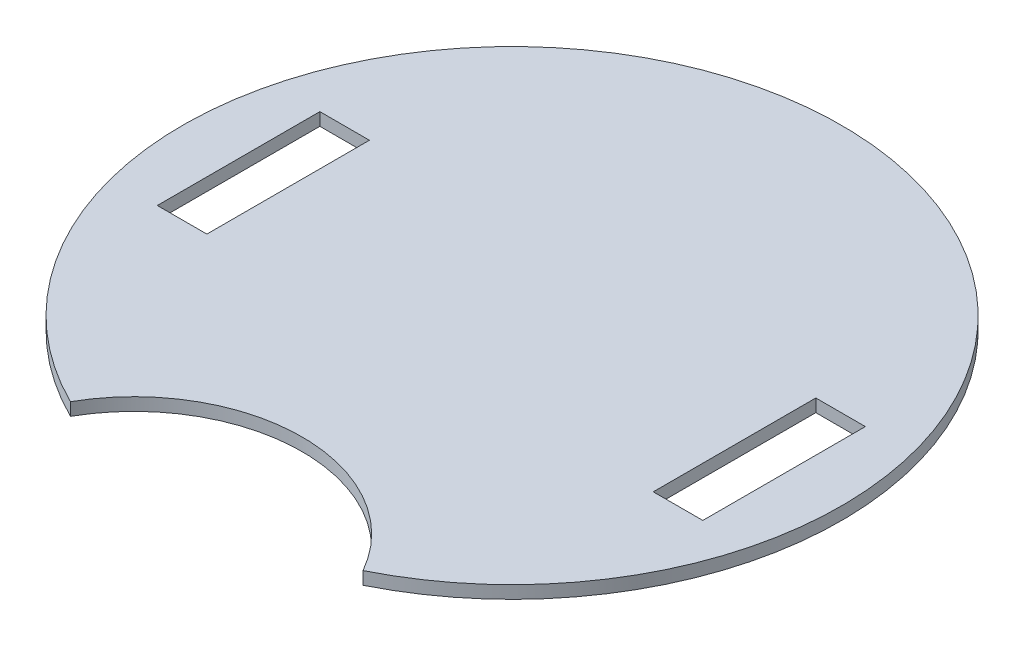
ISO-10303-21;
HEADER;
FILE_DESCRIPTION(('STEP AP214'),'2;1');
FILE_NAME('part.step','',(''),(''),'','','');
FILE_SCHEMA(('AUTOMOTIVE_DESIGN { 1 0 10303 214 1 1 1 1 }'));
ENDSEC;
DATA;
#1=APPLICATION_CONTEXT('core data for automotive mechanical design processes');
#2=APPLICATION_PROTOCOL_DEFINITION('international standard','automotive_design',2000,#1);
#3=PRODUCT_CONTEXT('',#1,'mechanical');
#4=PRODUCT('Part','Part','',(#3));
#5=PRODUCT_RELATED_PRODUCT_CATEGORY('part','',(#4));
#6=PRODUCT_DEFINITION_FORMATION('','',#4);
#7=PRODUCT_DEFINITION_CONTEXT('part definition',#1,'design');
#8=PRODUCT_DEFINITION('design','',#6,#7);
#9=PRODUCT_DEFINITION_SHAPE('','',#8);
#10=(LENGTH_UNIT() NAMED_UNIT(*) SI_UNIT(.MILLI.,.METRE.));
#11=(NAMED_UNIT(*) PLANE_ANGLE_UNIT() SI_UNIT($,.RADIAN.));
#12=(NAMED_UNIT(*) SI_UNIT($,.STERADIAN.) SOLID_ANGLE_UNIT());
#13=UNCERTAINTY_MEASURE_WITH_UNIT(LENGTH_MEASURE(1.E-05),#10,'distance_accuracy_value','');
#14=(GEOMETRIC_REPRESENTATION_CONTEXT(3) GLOBAL_UNCERTAINTY_ASSIGNED_CONTEXT((#13)) GLOBAL_UNIT_ASSIGNED_CONTEXT((#10,
#11,#12)) REPRESENTATION_CONTEXT('',''));
#15=CARTESIAN_POINT('',(0.,0.,0.));
#16=DIRECTION('',(0.,0.,1.));
#17=DIRECTION('',(1.,0.,0.));
#18=AXIS2_PLACEMENT_3D('',#15,#16,#17);
#19=CARTESIAN_POINT('',(0.,2.9,86.0416168146049));
#20=DIRECTION('',(0.,-1.,0.));
#21=DIRECTION('',(0.,0.,-1.));
#22=AXIS2_PLACEMENT_3D('',#19,#20,#21);
#23=CYLINDRICAL_SURFACE('',#22,38.25);
#24=CARTESIAN_POINT('',(0.,0.,86.0416168146049));
#25=DIRECTION('',(0.,-1.,0.));
#26=DIRECTION('',(0.,0.,1.));
#27=AXIS2_PLACEMENT_3D('',#24,#25,#26);
#28=CIRCLE('',#27,38.25);
#29=CARTESIAN_POINT('',(-33.2911053697012,0.,67.2064156406474));
#30=VERTEX_POINT('',#29);
#31=CARTESIAN_POINT('',(33.2911053697012,0.,67.2064156406474));
#32=VERTEX_POINT('',#31);
#33=EDGE_CURVE('E171',#30,#32,#28,.T.);
#34=ORIENTED_EDGE('',*,*,#33,.T.);
#35=DIRECTION('',(0.,-1.,0.));
#36=VECTOR('',#35,1.);
#37=CARTESIAN_POINT('',(33.2911053697012,2.9,67.2064156406474));
#38=LINE('',#37,#36);
#39=CARTESIAN_POINT('',(33.2911053697012,2.9,67.2064156406474));
#40=VERTEX_POINT('',#39);
#41=EDGE_CURVE('E11',#40,#32,#38,.T.);
#42=ORIENTED_EDGE('',*,*,#41,.F.);
#43=CARTESIAN_POINT('',(0.,2.9,86.0416168146049));
#44=DIRECTION('',(0.,-1.,0.));
#45=DIRECTION('',(0.,0.,1.));
#46=AXIS2_PLACEMENT_3D('',#43,#44,#45);
#47=CIRCLE('',#46,38.25);
#48=CARTESIAN_POINT('',(-33.2911053697012,2.9,67.2064156406474));
#49=VERTEX_POINT('',#48);
#50=EDGE_CURVE('E178',#49,#40,#47,.T.);
#51=ORIENTED_EDGE('',*,*,#50,.F.);
#52=DIRECTION('',(0.,-1.,0.));
#53=VECTOR('',#52,1.);
#54=CARTESIAN_POINT('',(-33.2911053697012,2.9,67.2064156406474));
#55=LINE('',#54,#53);
#56=EDGE_CURVE('E40',#49,#30,#55,.T.);
#57=ORIENTED_EDGE('',*,*,#56,.T.);
#58=EDGE_LOOP('',(#34,#42,#51,#57));
#59=FACE_BOUND('',#58,.T.);
#60=ADVANCED_FACE('F33',(#59),#23,.F.);
#61=CARTESIAN_POINT('',(0.,2.9,0.));
#62=DIRECTION('',(0.,-1.,0.));
#63=DIRECTION('',(0.,0.,-1.));
#64=AXIS2_PLACEMENT_3D('',#61,#62,#63);
#65=CYLINDRICAL_SURFACE('',#64,75.);
#66=CARTESIAN_POINT('',(0.,0.,0.));
#67=DIRECTION('',(0.,1.,0.));
#68=DIRECTION('',(0.,0.,1.));
#69=AXIS2_PLACEMENT_3D('',#66,#67,#68);
#70=CIRCLE('',#69,75.);
#71=EDGE_CURVE('E182',#32,#30,#70,.T.);
#72=ORIENTED_EDGE('',*,*,#71,.T.);
#73=ORIENTED_EDGE('',*,*,#56,.F.);
#74=CARTESIAN_POINT('',(0.,2.9,0.));
#75=DIRECTION('',(0.,1.,0.));
#76=DIRECTION('',(0.,0.,1.));
#77=AXIS2_PLACEMENT_3D('',#74,#75,#76);
#78=CIRCLE('',#77,75.);
#79=EDGE_CURVE('E181',#40,#49,#78,.T.);
#80=ORIENTED_EDGE('',*,*,#79,.F.);
#81=ORIENTED_EDGE('',*,*,#41,.T.);
#82=EDGE_LOOP('',(#72,#73,#80,#81));
#83=FACE_BOUND('',#82,.T.);
#84=ADVANCED_FACE('F194',(#83),#65,.T.);
#85=CARTESIAN_POINT('',(0.,2.9,43.0208084073025));
#86=DIRECTION('',(0.,1.,0.));
#87=DIRECTION('',(0.,0.,1.));
#88=AXIS2_PLACEMENT_3D('',#85,#86,#87);
#89=PLANE('',#88);
#90=DIRECTION('',(0.,0.,1.));
#91=VECTOR('',#90,1.);
#92=CARTESIAN_POINT('',(-62.0709467802583,2.9,-18.3300396675502));
#93=LINE('',#92,#91);
#94=CARTESIAN_POINT('',(-62.0709467802583,2.9,-18.3300396675502));
#95=VERTEX_POINT('',#94);
#96=CARTESIAN_POINT('',(-62.0709467802583,2.9,18.6617271703361));
#97=VERTEX_POINT('',#96);
#98=EDGE_CURVE('E47',#95,#97,#93,.T.);
#99=ORIENTED_EDGE('',*,*,#98,.F.);
#100=DIRECTION('',(-1.,0.,0.));
#101=VECTOR('',#100,1.);
#102=CARTESIAN_POINT('',(-62.0709467802583,2.9,-18.3300396675502));
#103=LINE('',#102,#101);
#104=CARTESIAN_POINT('',(-50.7952486102618,2.9,-18.3300396675502));
#105=VERTEX_POINT('',#104);
#106=EDGE_CURVE('E127',#105,#95,#103,.T.);
#107=ORIENTED_EDGE('',*,*,#106,.F.);
#108=DIRECTION('',(0.,0.,-1.));
#109=VECTOR('',#108,1.);
#110=CARTESIAN_POINT('',(-50.7952486102618,2.9,-18.3300396675502));
#111=LINE('',#110,#109);
#112=CARTESIAN_POINT('',(-50.7952486102618,2.9,18.6617271703361));
#113=VERTEX_POINT('',#112);
#114=EDGE_CURVE('E130',#113,#105,#111,.T.);
#115=ORIENTED_EDGE('',*,*,#114,.F.);
#116=DIRECTION('',(1.,0.,0.));
#117=VECTOR('',#116,1.);
#118=CARTESIAN_POINT('',(-62.0709467802583,2.9,18.6617271703361));
#119=LINE('',#118,#117);
#120=EDGE_CURVE('E136',#97,#113,#119,.T.);
#121=ORIENTED_EDGE('',*,*,#120,.F.);
#122=EDGE_LOOP('',(#99,#107,#115,#121));
#123=FACE_BOUND('',#122,.T.);
#124=DIRECTION('',(0.,0.,1.));
#125=VECTOR('',#124,1.);
#126=CARTESIAN_POINT('',(50.7952486102618,2.9,-18.3300396675502));
#127=LINE('',#126,#125);
#128=CARTESIAN_POINT('',(50.7952486102618,2.9,-18.3300396675502));
#129=VERTEX_POINT('',#128);
#130=CARTESIAN_POINT('',(50.7952486102618,2.9,18.6617271703361));
#131=VERTEX_POINT('',#130);
#132=EDGE_CURVE('E142',#129,#131,#127,.T.);
#133=ORIENTED_EDGE('',*,*,#132,.F.);
#134=DIRECTION('',(-1.,0.,0.));
#135=VECTOR('',#134,1.);
#136=CARTESIAN_POINT('',(62.0709467802583,2.9,-18.3300396675502));
#137=LINE('',#136,#135);
#138=CARTESIAN_POINT('',(62.0709467802583,2.9,-18.3300396675502));
#139=VERTEX_POINT('',#138);
#140=EDGE_CURVE('E150',#139,#129,#137,.T.);
#141=ORIENTED_EDGE('',*,*,#140,.F.);
#142=DIRECTION('',(0.,0.,-1.));
#143=VECTOR('',#142,1.);
#144=CARTESIAN_POINT('',(62.0709467802583,2.9,-18.3300396675502));
#145=LINE('',#144,#143);
#146=CARTESIAN_POINT('',(62.0709467802583,2.9,18.6617271703361));
#147=VERTEX_POINT('',#146);
#148=EDGE_CURVE('E164',#147,#139,#145,.T.);
#149=ORIENTED_EDGE('',*,*,#148,.F.);
#150=DIRECTION('',(1.,0.,0.));
#151=VECTOR('',#150,1.);
#152=CARTESIAN_POINT('',(62.0709467802583,2.9,18.6617271703361));
#153=LINE('',#152,#151);
#154=EDGE_CURVE('E161',#131,#147,#153,.T.);
#155=ORIENTED_EDGE('',*,*,#154,.F.);
#156=EDGE_LOOP('',(#133,#141,#149,#155));
#157=FACE_BOUND('',#156,.T.);
#158=ORIENTED_EDGE('',*,*,#50,.T.);
#159=ORIENTED_EDGE('',*,*,#79,.T.);
#160=EDGE_LOOP('',(#158,#159));
#161=FACE_BOUND('',#160,.T.);
#162=ADVANCED_FACE('F196',(#123,#157,#161),#89,.T.);
#163=CARTESIAN_POINT('',(0.,0.,43.0208084073025));
#164=DIRECTION('',(0.,1.,0.));
#165=DIRECTION('',(0.,0.,1.));
#166=AXIS2_PLACEMENT_3D('',#163,#164,#165);
#167=PLANE('',#166);
#168=DIRECTION('',(-1.,0.,0.));
#169=VECTOR('',#168,1.);
#170=CARTESIAN_POINT('',(-62.0709467802583,0.,-18.3300396675502));
#171=LINE('',#170,#169);
#172=CARTESIAN_POINT('',(-50.7952486102618,0.,-18.3300396675502));
#173=VERTEX_POINT('',#172);
#174=CARTESIAN_POINT('',(-62.0709467802583,0.,-18.3300396675502));
#175=VERTEX_POINT('',#174);
#176=EDGE_CURVE('E117',#173,#175,#171,.T.);
#177=ORIENTED_EDGE('',*,*,#176,.T.);
#178=DIRECTION('',(0.,0.,1.));
#179=VECTOR('',#178,1.);
#180=CARTESIAN_POINT('',(-62.0709467802583,0.,-18.3300396675502));
#181=LINE('',#180,#179);
#182=CARTESIAN_POINT('',(-62.0709467802583,0.,18.6617271703361));
#183=VERTEX_POINT('',#182);
#184=EDGE_CURVE('E111',#175,#183,#181,.T.);
#185=ORIENTED_EDGE('',*,*,#184,.T.);
#186=DIRECTION('',(1.,0.,0.));
#187=VECTOR('',#186,1.);
#188=CARTESIAN_POINT('',(-62.0709467802583,0.,18.6617271703361));
#189=LINE('',#188,#187);
#190=CARTESIAN_POINT('',(-50.7952486102618,0.,18.6617271703361));
#191=VERTEX_POINT('',#190);
#192=EDGE_CURVE('E120',#183,#191,#189,.T.);
#193=ORIENTED_EDGE('',*,*,#192,.T.);
#194=DIRECTION('',(0.,0.,-1.));
#195=VECTOR('',#194,1.);
#196=CARTESIAN_POINT('',(-50.7952486102618,0.,-18.3300396675502));
#197=LINE('',#196,#195);
#198=EDGE_CURVE('E55',#191,#173,#197,.T.);
#199=ORIENTED_EDGE('',*,*,#198,.T.);
#200=EDGE_LOOP('',(#177,#185,#193,#199));
#201=FACE_BOUND('',#200,.T.);
#202=DIRECTION('',(-1.,0.,0.));
#203=VECTOR('',#202,1.);
#204=CARTESIAN_POINT('',(62.0709467802583,0.,-18.3300396675502));
#205=LINE('',#204,#203);
#206=CARTESIAN_POINT('',(62.0709467802583,0.,-18.3300396675502));
#207=VERTEX_POINT('',#206);
#208=CARTESIAN_POINT('',(50.7952486102618,0.,-18.3300396675502));
#209=VERTEX_POINT('',#208);
#210=EDGE_CURVE('E156',#207,#209,#205,.T.);
#211=ORIENTED_EDGE('',*,*,#210,.T.);
#212=DIRECTION('',(0.,0.,1.));
#213=VECTOR('',#212,1.);
#214=CARTESIAN_POINT('',(50.7952486102618,0.,-18.3300396675502));
#215=LINE('',#214,#213);
#216=CARTESIAN_POINT('',(50.7952486102618,0.,18.6617271703361));
#217=VERTEX_POINT('',#216);
#218=EDGE_CURVE('E146',#209,#217,#215,.T.);
#219=ORIENTED_EDGE('',*,*,#218,.T.);
#220=DIRECTION('',(1.,0.,0.));
#221=VECTOR('',#220,1.);
#222=CARTESIAN_POINT('',(62.0709467802583,0.,18.6617271703361));
#223=LINE('',#222,#221);
#224=CARTESIAN_POINT('',(62.0709467802583,0.,18.6617271703361));
#225=VERTEX_POINT('',#224);
#226=EDGE_CURVE('E149',#217,#225,#223,.T.);
#227=ORIENTED_EDGE('',*,*,#226,.T.);
#228=DIRECTION('',(0.,0.,-1.));
#229=VECTOR('',#228,1.);
#230=CARTESIAN_POINT('',(62.0709467802583,0.,-18.3300396675502));
#231=LINE('',#230,#229);
#232=EDGE_CURVE('E153',#225,#207,#231,.T.);
#233=ORIENTED_EDGE('',*,*,#232,.T.);
#234=EDGE_LOOP('',(#211,#219,#227,#233));
#235=FACE_BOUND('',#234,.T.);
#236=ORIENTED_EDGE('',*,*,#33,.F.);
#237=ORIENTED_EDGE('',*,*,#71,.F.);
#238=EDGE_LOOP('',(#236,#237));
#239=FACE_BOUND('',#238,.T.);
#240=ADVANCED_FACE('F124',(#201,#235,#239),#167,.F.);
#241=CARTESIAN_POINT('',(50.7952486102618,0.,-18.3300396675502));
#242=DIRECTION('',(-1.,0.,0.));
#243=DIRECTION('',(0.,0.,1.));
#244=AXIS2_PLACEMENT_3D('',#241,#242,#243);
#245=PLANE('',#244);
#246=ORIENTED_EDGE('',*,*,#132,.T.);
#247=DIRECTION('',(0.,1.,0.));
#248=VECTOR('',#247,1.);
#249=CARTESIAN_POINT('',(50.7952486102618,0.,18.6617271703361));
#250=LINE('',#249,#248);
#251=EDGE_CURVE('E159',#217,#131,#250,.T.);
#252=ORIENTED_EDGE('',*,*,#251,.F.);
#253=ORIENTED_EDGE('',*,*,#218,.F.);
#254=DIRECTION('',(0.,1.,0.));
#255=VECTOR('',#254,1.);
#256=CARTESIAN_POINT('',(50.7952486102618,0.,-18.3300396675502));
#257=LINE('',#256,#255);
#258=EDGE_CURVE('E169',#209,#129,#257,.T.);
#259=ORIENTED_EDGE('',*,*,#258,.T.);
#260=EDGE_LOOP('',(#246,#252,#253,#259));
#261=FACE_BOUND('',#260,.T.);
#262=ADVANCED_FACE('F204',(#261),#245,.F.);
#263=CARTESIAN_POINT('',(62.0709467802583,0.,-18.3300396675502));
#264=DIRECTION('',(0.,0.,-1.));
#265=DIRECTION('',(-1.,0.,0.));
#266=AXIS2_PLACEMENT_3D('',#263,#264,#265);
#267=PLANE('',#266);
#268=ORIENTED_EDGE('',*,*,#140,.T.);
#269=ORIENTED_EDGE('',*,*,#258,.F.);
#270=ORIENTED_EDGE('',*,*,#210,.F.);
#271=DIRECTION('',(0.,1.,0.));
#272=VECTOR('',#271,1.);
#273=CARTESIAN_POINT('',(62.0709467802583,0.,-18.3300396675502));
#274=LINE('',#273,#272);
#275=EDGE_CURVE('E172',#207,#139,#274,.T.);
#276=ORIENTED_EDGE('',*,*,#275,.T.);
#277=EDGE_LOOP('',(#268,#269,#270,#276));
#278=FACE_BOUND('',#277,.T.);
#279=ADVANCED_FACE('F234',(#278),#267,.F.);
#280=CARTESIAN_POINT('',(62.0709467802583,0.,-18.3300396675502));
#281=DIRECTION('',(1.,0.,0.));
#282=DIRECTION('',(0.,0.,-1.));
#283=AXIS2_PLACEMENT_3D('',#280,#281,#282);
#284=PLANE('',#283);
#285=ORIENTED_EDGE('',*,*,#148,.T.);
#286=ORIENTED_EDGE('',*,*,#275,.F.);
#287=ORIENTED_EDGE('',*,*,#232,.F.);
#288=DIRECTION('',(0.,1.,0.));
#289=VECTOR('',#288,1.);
#290=CARTESIAN_POINT('',(62.0709467802583,0.,18.6617271703361));
#291=LINE('',#290,#289);
#292=EDGE_CURVE('E174',#225,#147,#291,.T.);
#293=ORIENTED_EDGE('',*,*,#292,.T.);
#294=EDGE_LOOP('',(#285,#286,#287,#293));
#295=FACE_BOUND('',#294,.T.);
#296=ADVANCED_FACE('F243',(#295),#284,.F.);
#297=CARTESIAN_POINT('',(62.0709467802583,0.,18.6617271703361));
#298=DIRECTION('',(0.,0.,1.));
#299=DIRECTION('',(1.,0.,0.));
#300=AXIS2_PLACEMENT_3D('',#297,#298,#299);
#301=PLANE('',#300);
#302=ORIENTED_EDGE('',*,*,#154,.T.);
#303=ORIENTED_EDGE('',*,*,#292,.F.);
#304=ORIENTED_EDGE('',*,*,#226,.F.);
#305=ORIENTED_EDGE('',*,*,#251,.T.);
#306=EDGE_LOOP('',(#302,#303,#304,#305));
#307=FACE_BOUND('',#306,.T.);
#308=ADVANCED_FACE('F253',(#307),#301,.F.);
#309=CARTESIAN_POINT('',(-62.0709467802583,0.,-18.3300396675502));
#310=DIRECTION('',(-1.,0.,0.));
#311=DIRECTION('',(0.,0.,1.));
#312=AXIS2_PLACEMENT_3D('',#309,#310,#311);
#313=PLANE('',#312);
#314=ORIENTED_EDGE('',*,*,#98,.T.);
#315=DIRECTION('',(0.,1.,0.));
#316=VECTOR('',#315,1.);
#317=CARTESIAN_POINT('',(-62.0709467802583,0.,18.6617271703361));
#318=LINE('',#317,#316);
#319=EDGE_CURVE('E107',#183,#97,#318,.T.);
#320=ORIENTED_EDGE('',*,*,#319,.F.);
#321=ORIENTED_EDGE('',*,*,#184,.F.);
#322=DIRECTION('',(0.,1.,0.));
#323=VECTOR('',#322,1.);
#324=CARTESIAN_POINT('',(-62.0709467802583,0.,-18.3300396675502));
#325=LINE('',#324,#323);
#326=EDGE_CURVE('E140',#175,#95,#325,.T.);
#327=ORIENTED_EDGE('',*,*,#326,.T.);
#328=EDGE_LOOP('',(#314,#320,#321,#327));
#329=FACE_BOUND('',#328,.T.);
#330=ADVANCED_FACE('F109',(#329),#313,.F.);
#331=CARTESIAN_POINT('',(-62.0709467802583,0.,-18.3300396675502));
#332=DIRECTION('',(0.,0.,-1.));
#333=DIRECTION('',(-1.,0.,0.));
#334=AXIS2_PLACEMENT_3D('',#331,#332,#333);
#335=PLANE('',#334);
#336=ORIENTED_EDGE('',*,*,#106,.T.);
#337=ORIENTED_EDGE('',*,*,#326,.F.);
#338=ORIENTED_EDGE('',*,*,#176,.F.);
#339=DIRECTION('',(0.,1.,0.));
#340=VECTOR('',#339,1.);
#341=CARTESIAN_POINT('',(-50.7952486102618,0.,-18.3300396675502));
#342=LINE('',#341,#340);
#343=EDGE_CURVE('E143',#173,#105,#342,.T.);
#344=ORIENTED_EDGE('',*,*,#343,.T.);
#345=EDGE_LOOP('',(#336,#337,#338,#344));
#346=FACE_BOUND('',#345,.T.);
#347=ADVANCED_FACE('F272',(#346),#335,.F.);
#348=CARTESIAN_POINT('',(-50.7952486102618,0.,-18.3300396675502));
#349=DIRECTION('',(1.,0.,0.));
#350=DIRECTION('',(0.,0.,-1.));
#351=AXIS2_PLACEMENT_3D('',#348,#349,#350);
#352=PLANE('',#351);
#353=ORIENTED_EDGE('',*,*,#114,.T.);
#354=ORIENTED_EDGE('',*,*,#343,.F.);
#355=ORIENTED_EDGE('',*,*,#198,.F.);
#356=DIRECTION('',(0.,1.,0.));
#357=VECTOR('',#356,1.);
#358=CARTESIAN_POINT('',(-50.7952486102618,0.,18.6617271703361));
#359=LINE('',#358,#357);
#360=EDGE_CURVE('E116',#191,#113,#359,.T.);
#361=ORIENTED_EDGE('',*,*,#360,.T.);
#362=EDGE_LOOP('',(#353,#354,#355,#361));
#363=FACE_BOUND('',#362,.T.);
#364=ADVANCED_FACE('F281',(#363),#352,.F.);
#365=CARTESIAN_POINT('',(-62.0709467802583,0.,18.6617271703361));
#366=DIRECTION('',(0.,0.,1.));
#367=DIRECTION('',(1.,0.,0.));
#368=AXIS2_PLACEMENT_3D('',#365,#366,#367);
#369=PLANE('',#368);
#370=ORIENTED_EDGE('',*,*,#120,.T.);
#371=ORIENTED_EDGE('',*,*,#360,.F.);
#372=ORIENTED_EDGE('',*,*,#192,.F.);
#373=ORIENTED_EDGE('',*,*,#319,.T.);
#374=EDGE_LOOP('',(#370,#371,#372,#373));
#375=FACE_BOUND('',#374,.T.);
#376=ADVANCED_FACE('F121',(#375),#369,.F.);
#377=CLOSED_SHELL('',(#60,#84,#162,#240,#262,#279,#296,#308,#330,#347,#364,#376));
#378=MANIFOLD_SOLID_BREP('B2',#377);
#379=ADVANCED_BREP_SHAPE_REPRESENTATION('',(#18,#378),#14);
#380=SHAPE_DEFINITION_REPRESENTATION(#9,#379);
ENDSEC;
END-ISO-10303-21;
